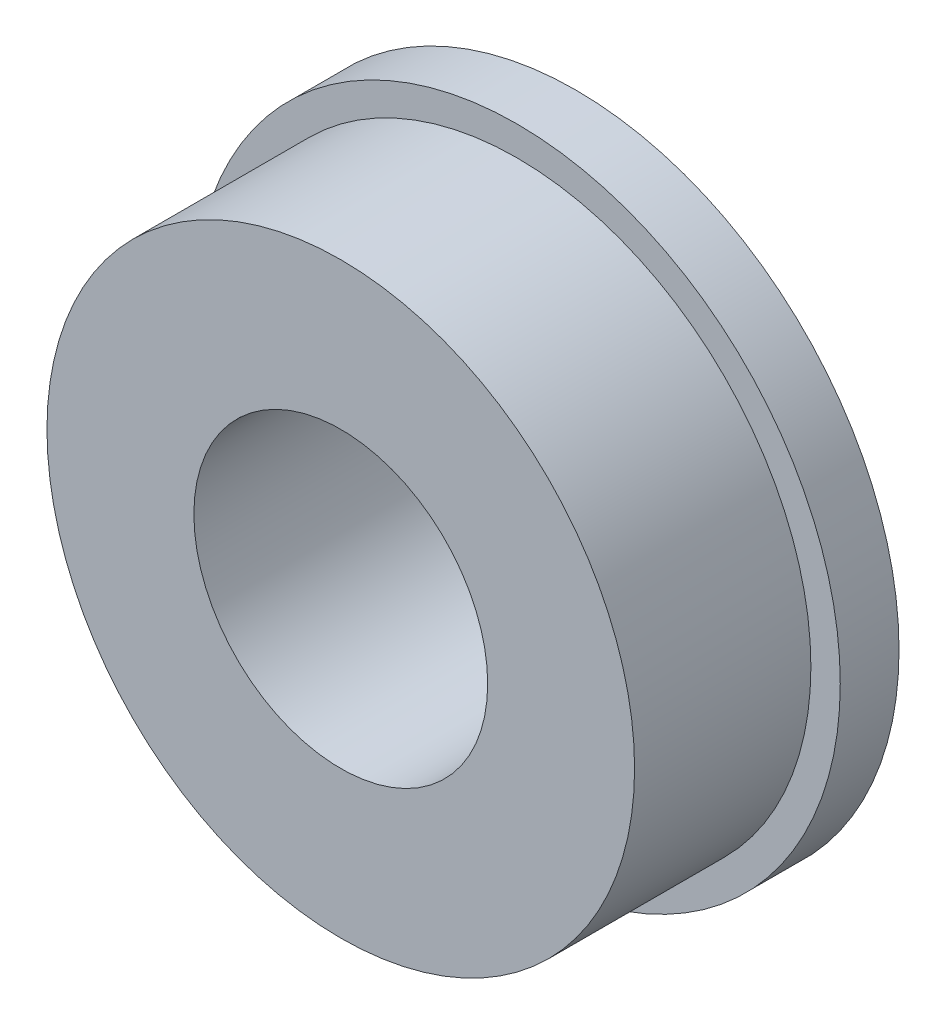
ISO-10303-21;
HEADER;
FILE_DESCRIPTION(('STEP AP214'),'2;1');
FILE_NAME('part.step','',(''),(''),'','','');
FILE_SCHEMA(('AUTOMOTIVE_DESIGN { 1 0 10303 214 1 1 1 1 }'));
ENDSEC;
DATA;
#1=APPLICATION_CONTEXT('core data for automotive mechanical design processes');
#2=APPLICATION_PROTOCOL_DEFINITION('international standard','automotive_design',2000,#1);
#3=PRODUCT_CONTEXT('',#1,'mechanical');
#4=PRODUCT('Part','Part','',(#3));
#5=PRODUCT_RELATED_PRODUCT_CATEGORY('part','',(#4));
#6=PRODUCT_DEFINITION_FORMATION('','',#4);
#7=PRODUCT_DEFINITION_CONTEXT('part definition',#1,'design');
#8=PRODUCT_DEFINITION('design','',#6,#7);
#9=PRODUCT_DEFINITION_SHAPE('','',#8);
#10=(LENGTH_UNIT() NAMED_UNIT(*) SI_UNIT(.MILLI.,.METRE.));
#11=(NAMED_UNIT(*) PLANE_ANGLE_UNIT() SI_UNIT($,.RADIAN.));
#12=(NAMED_UNIT(*) SI_UNIT($,.STERADIAN.) SOLID_ANGLE_UNIT());
#13=UNCERTAINTY_MEASURE_WITH_UNIT(LENGTH_MEASURE(1.E-05),#10,'distance_accuracy_value','');
#14=(GEOMETRIC_REPRESENTATION_CONTEXT(3) GLOBAL_UNCERTAINTY_ASSIGNED_CONTEXT((#13)) GLOBAL_UNIT_ASSIGNED_CONTEXT((#10,
#11,#12)) REPRESENTATION_CONTEXT('',''));
#15=CARTESIAN_POINT('',(0.,0.,0.));
#16=DIRECTION('',(0.,0.,1.));
#17=DIRECTION('',(1.,0.,0.));
#18=AXIS2_PLACEMENT_3D('',#15,#16,#17);
#19=CARTESIAN_POINT('',(0.,0.,3.));
#20=DIRECTION('',(0.,0.,1.));
#21=DIRECTION('',(1.,0.,0.));
#22=AXIS2_PLACEMENT_3D('',#19,#20,#21);
#23=PLANE('',#22);
#24=CARTESIAN_POINT('',(0.,0.,3.));
#25=DIRECTION('',(0.,0.,1.));
#26=DIRECTION('',(1.,0.,0.));
#27=AXIS2_PLACEMENT_3D('',#24,#25,#26);
#28=CIRCLE('',#27,5.);
#29=CARTESIAN_POINT('',(5.,0.,3.));
#30=VERTEX_POINT('',#29);
#31=EDGE_CURVE('E11',#30,#30,#28,.T.);
#32=ORIENTED_EDGE('',*,*,#31,.T.);
#33=EDGE_LOOP('',(#32));
#34=FACE_BOUND('',#33,.T.);
#35=CARTESIAN_POINT('',(0.,0.,3.));
#36=DIRECTION('',(0.,0.,1.));
#37=DIRECTION('',(1.,0.,0.));
#38=AXIS2_PLACEMENT_3D('',#35,#36,#37);
#39=CIRCLE('',#38,2.5);
#40=CARTESIAN_POINT('',(2.5,0.,3.));
#41=VERTEX_POINT('',#40);
#42=EDGE_CURVE('E59',#41,#41,#39,.T.);
#43=ORIENTED_EDGE('',*,*,#42,.F.);
#44=EDGE_LOOP('',(#43));
#45=FACE_BOUND('',#44,.T.);
#46=ADVANCED_FACE('F51',(#34,#45),#23,.T.);
#47=CARTESIAN_POINT('',(0.,0.,3.));
#48=DIRECTION('',(0.,0.,-1.));
#49=DIRECTION('',(-1.,0.,0.));
#50=AXIS2_PLACEMENT_3D('',#47,#48,#49);
#51=CYLINDRICAL_SURFACE('',#50,5.);
#52=ORIENTED_EDGE('',*,*,#31,.F.);
#53=EDGE_LOOP('',(#52));
#54=FACE_BOUND('',#53,.T.);
#55=CARTESIAN_POINT('',(0.,0.,0.));
#56=DIRECTION('',(0.,0.,1.));
#57=DIRECTION('',(1.,0.,0.));
#58=AXIS2_PLACEMENT_3D('',#55,#56,#57);
#59=CIRCLE('',#58,5.);
#60=CARTESIAN_POINT('',(5.,0.,0.));
#61=VERTEX_POINT('',#60);
#62=EDGE_CURVE('E55',#61,#61,#59,.T.);
#63=ORIENTED_EDGE('',*,*,#62,.T.);
#64=EDGE_LOOP('',(#63));
#65=FACE_BOUND('',#64,.T.);
#66=ADVANCED_FACE('F53',(#54,#65),#51,.T.);
#67=CARTESIAN_POINT('',(0.,0.,3.));
#68=DIRECTION('',(0.,0.,-1.));
#69=DIRECTION('',(-1.,0.,0.));
#70=AXIS2_PLACEMENT_3D('',#67,#68,#69);
#71=CYLINDRICAL_SURFACE('',#70,2.5);
#72=ORIENTED_EDGE('',*,*,#42,.T.);
#73=EDGE_LOOP('',(#72));
#74=FACE_BOUND('',#73,.T.);
#75=CARTESIAN_POINT('',(0.,0.,-1.));
#76=DIRECTION('',(0.,0.,-1.));
#77=DIRECTION('',(-1.,0.,0.));
#78=AXIS2_PLACEMENT_3D('',#75,#76,#77);
#79=CIRCLE('',#78,2.5);
#80=CARTESIAN_POINT('',(-2.5,0.,-1.));
#81=VERTEX_POINT('',#80);
#82=EDGE_CURVE('E69',#81,#81,#79,.T.);
#83=ORIENTED_EDGE('',*,*,#82,.T.);
#84=EDGE_LOOP('',(#83));
#85=FACE_BOUND('',#84,.T.);
#86=ADVANCED_FACE('F75',(#74,#85),#71,.F.);
#87=CARTESIAN_POINT('',(0.,0.,-1.));
#88=DIRECTION('',(0.,0.,-1.));
#89=DIRECTION('',(-1.,0.,0.));
#90=AXIS2_PLACEMENT_3D('',#87,#88,#89);
#91=PLANE('',#90);
#92=CARTESIAN_POINT('',(0.,0.,-1.));
#93=DIRECTION('',(0.,0.,-1.));
#94=DIRECTION('',(-1.,0.,0.));
#95=AXIS2_PLACEMENT_3D('',#92,#93,#94);
#96=CIRCLE('',#95,5.5);
#97=CARTESIAN_POINT('',(-5.5,0.,-1.));
#98=VERTEX_POINT('',#97);
#99=EDGE_CURVE('E68',#98,#98,#96,.T.);
#100=ORIENTED_EDGE('',*,*,#99,.T.);
#101=EDGE_LOOP('',(#100));
#102=FACE_BOUND('',#101,.T.);
#103=ORIENTED_EDGE('',*,*,#82,.F.);
#104=EDGE_LOOP('',(#103));
#105=FACE_BOUND('',#104,.T.);
#106=ADVANCED_FACE('F77',(#102,#105),#91,.T.);
#107=CARTESIAN_POINT('',(0.,0.,0.));
#108=DIRECTION('',(0.,0.,-1.));
#109=DIRECTION('',(-1.,0.,0.));
#110=AXIS2_PLACEMENT_3D('',#107,#108,#109);
#111=PLANE('',#110);
#112=ORIENTED_EDGE('',*,*,#62,.F.);
#113=EDGE_LOOP('',(#112));
#114=FACE_BOUND('',#113,.T.);
#115=CARTESIAN_POINT('',(0.,0.,0.));
#116=DIRECTION('',(0.,0.,-1.));
#117=DIRECTION('',(-1.,0.,0.));
#118=AXIS2_PLACEMENT_3D('',#115,#116,#117);
#119=CIRCLE('',#118,5.5);
#120=CARTESIAN_POINT('',(-5.5,0.,0.));
#121=VERTEX_POINT('',#120);
#122=EDGE_CURVE('E65',#121,#121,#119,.T.);
#123=ORIENTED_EDGE('',*,*,#122,.F.);
#124=EDGE_LOOP('',(#123));
#125=FACE_BOUND('',#124,.T.);
#126=ADVANCED_FACE('F79',(#114,#125),#111,.F.);
#127=CARTESIAN_POINT('',(0.,0.,-1.));
#128=DIRECTION('',(0.,0.,1.));
#129=DIRECTION('',(1.,0.,0.));
#130=AXIS2_PLACEMENT_3D('',#127,#128,#129);
#131=CYLINDRICAL_SURFACE('',#130,5.5);
#132=ORIENTED_EDGE('',*,*,#99,.F.);
#133=EDGE_LOOP('',(#132));
#134=FACE_BOUND('',#133,.T.);
#135=ORIENTED_EDGE('',*,*,#122,.T.);
#136=EDGE_LOOP('',(#135));
#137=FACE_BOUND('',#136,.T.);
#138=ADVANCED_FACE('F86',(#134,#137),#131,.T.);
#139=CLOSED_SHELL('',(#46,#66,#86,#106,#126,#138));
#140=MANIFOLD_SOLID_BREP('B2',#139);
#141=ADVANCED_BREP_SHAPE_REPRESENTATION('',(#18,#140),#14);
#142=SHAPE_DEFINITION_REPRESENTATION(#9,#141);
ENDSEC;
END-ISO-10303-21;
